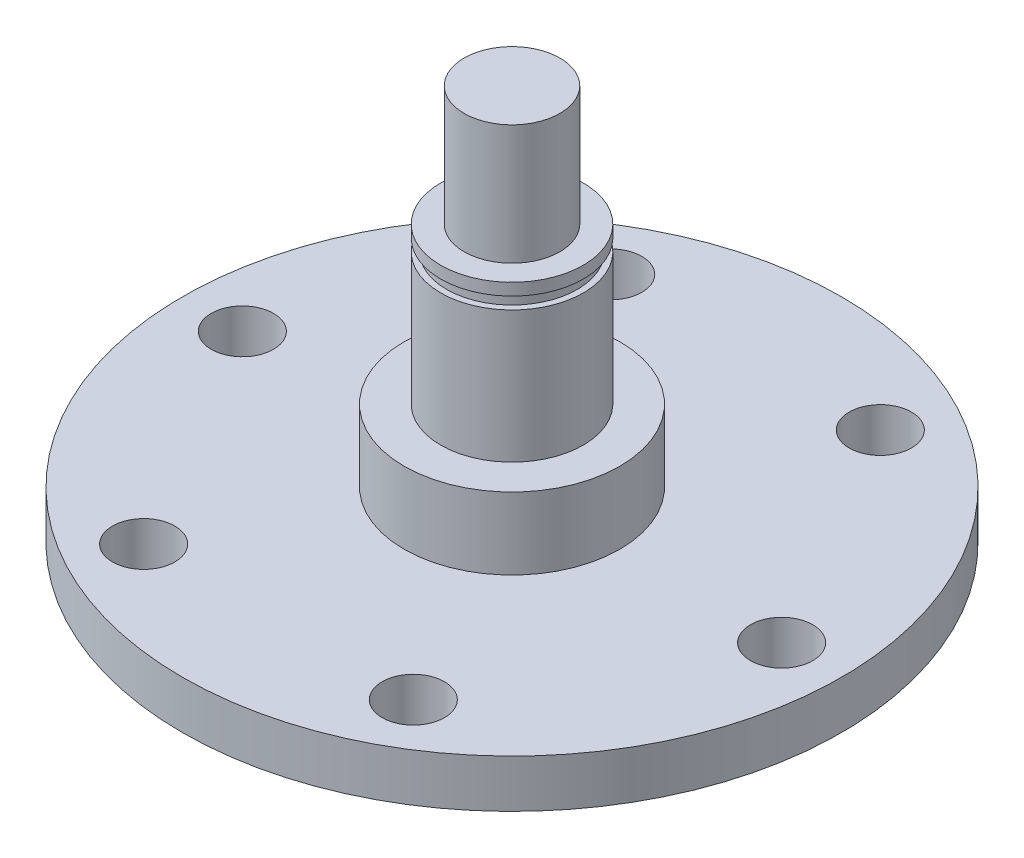
ISO-10303-21;
HEADER;
FILE_DESCRIPTION(('STEP AP214'),'2;1');
FILE_NAME('part.step','',(''),(''),'','','');
FILE_SCHEMA(('AUTOMOTIVE_DESIGN { 1 0 10303 214 1 1 1 1 }'));
ENDSEC;
DATA;
#1=APPLICATION_CONTEXT('core data for automotive mechanical design processes');
#2=APPLICATION_PROTOCOL_DEFINITION('international standard','automotive_design',2000,#1);
#3=PRODUCT_CONTEXT('',#1,'mechanical');
#4=PRODUCT('Part','Part','',(#3));
#5=PRODUCT_RELATED_PRODUCT_CATEGORY('part','',(#4));
#6=PRODUCT_DEFINITION_FORMATION('','',#4);
#7=PRODUCT_DEFINITION_CONTEXT('part definition',#1,'design');
#8=PRODUCT_DEFINITION('design','',#6,#7);
#9=PRODUCT_DEFINITION_SHAPE('','',#8);
#10=(LENGTH_UNIT() NAMED_UNIT(*) SI_UNIT(.MILLI.,.METRE.));
#11=(NAMED_UNIT(*) PLANE_ANGLE_UNIT() SI_UNIT($,.RADIAN.));
#12=(NAMED_UNIT(*) SI_UNIT($,.STERADIAN.) SOLID_ANGLE_UNIT());
#13=UNCERTAINTY_MEASURE_WITH_UNIT(LENGTH_MEASURE(1.E-05),#10,'distance_accuracy_value','');
#14=(GEOMETRIC_REPRESENTATION_CONTEXT(3) GLOBAL_UNCERTAINTY_ASSIGNED_CONTEXT((#13)) GLOBAL_UNIT_ASSIGNED_CONTEXT((#10,
#11,#12)) REPRESENTATION_CONTEXT('',''));
#15=CARTESIAN_POINT('',(0.,0.,0.));
#16=DIRECTION('',(0.,0.,1.));
#17=DIRECTION('',(1.,0.,0.));
#18=AXIS2_PLACEMENT_3D('',#15,#16,#17);
#19=CARTESIAN_POINT('',(0.,0.,0.));
#20=DIRECTION('',(0.,1.,0.));
#21=DIRECTION('',(0.,0.,1.));
#22=AXIS2_PLACEMENT_3D('',#19,#20,#21);
#23=PLANE('',#22);
#24=CARTESIAN_POINT('',(11.2500000000002,0.,-19.4855715851497));
#25=DIRECTION('',(0.,1.,0.));
#26=DIRECTION('',(0.,0.,1.));
#27=AXIS2_PLACEMENT_3D('',#24,#25,#26);
#28=CIRCLE('',#27,2.6);
#29=CARTESIAN_POINT('',(11.2500000000002,0.,-16.8855715851497));
#30=VERTEX_POINT('',#29);
#31=EDGE_CURVE('E103',#30,#30,#28,.T.);
#32=ORIENTED_EDGE('',*,*,#31,.T.);
#33=EDGE_LOOP('',(#32));
#34=FACE_BOUND('',#33,.T.);
#35=CARTESIAN_POINT('',(-11.2499999999998,0.,-19.48557158515));
#36=DIRECTION('',(0.,1.,0.));
#37=DIRECTION('',(0.,0.,1.));
#38=AXIS2_PLACEMENT_3D('',#35,#36,#37);
#39=CIRCLE('',#38,2.6);
#40=CARTESIAN_POINT('',(-11.2499999999998,0.,-16.88557158515));
#41=VERTEX_POINT('',#40);
#42=EDGE_CURVE('E97',#41,#41,#39,.T.);
#43=ORIENTED_EDGE('',*,*,#42,.T.);
#44=EDGE_LOOP('',(#43));
#45=FACE_BOUND('',#44,.T.);
#46=CARTESIAN_POINT('',(-22.5,0.,-1.57116660247941E-13));
#47=DIRECTION('',(0.,1.,0.));
#48=DIRECTION('',(0.,0.,1.));
#49=AXIS2_PLACEMENT_3D('',#46,#47,#48);
#50=CIRCLE('',#49,2.6);
#51=CARTESIAN_POINT('',(-22.5,0.,2.59999999999984));
#52=VERTEX_POINT('',#51);
#53=EDGE_CURVE('E91',#52,#52,#50,.T.);
#54=ORIENTED_EDGE('',*,*,#53,.T.);
#55=EDGE_LOOP('',(#54));
#56=FACE_BOUND('',#55,.T.);
#57=CARTESIAN_POINT('',(-11.2500000000001,0.,19.4855715851498));
#58=DIRECTION('',(0.,1.,0.));
#59=DIRECTION('',(0.,0.,1.));
#60=AXIS2_PLACEMENT_3D('',#57,#58,#59);
#61=CIRCLE('',#60,2.6);
#62=CARTESIAN_POINT('',(-11.2500000000001,0.,22.0855715851498));
#63=VERTEX_POINT('',#62);
#64=EDGE_CURVE('E85',#63,#63,#61,.T.);
#65=ORIENTED_EDGE('',*,*,#64,.T.);
#66=EDGE_LOOP('',(#65));
#67=FACE_BOUND('',#66,.T.);
#68=CARTESIAN_POINT('',(11.25,0.,19.4855715851499));
#69=DIRECTION('',(0.,1.,0.));
#70=DIRECTION('',(0.,0.,1.));
#71=AXIS2_PLACEMENT_3D('',#68,#69,#70);
#72=CIRCLE('',#71,2.6);
#73=CARTESIAN_POINT('',(11.25,0.,22.0855715851499));
#74=VERTEX_POINT('',#73);
#75=EDGE_CURVE('E79',#74,#74,#72,.T.);
#76=ORIENTED_EDGE('',*,*,#75,.T.);
#77=EDGE_LOOP('',(#76));
#78=FACE_BOUND('',#77,.T.);
#79=CARTESIAN_POINT('',(22.5,0.,0.));
#80=DIRECTION('',(0.,1.,0.));
#81=DIRECTION('',(0.,0.,1.));
#82=AXIS2_PLACEMENT_3D('',#79,#80,#81);
#83=CIRCLE('',#82,2.6);
#84=CARTESIAN_POINT('',(22.5,0.,2.6));
#85=VERTEX_POINT('',#84);
#86=EDGE_CURVE('E75',#85,#85,#83,.T.);
#87=ORIENTED_EDGE('',*,*,#86,.T.);
#88=EDGE_LOOP('',(#87));
#89=FACE_BOUND('',#88,.T.);
#90=CARTESIAN_POINT('',(0.,0.,0.));
#91=DIRECTION('',(0.,1.,0.));
#92=DIRECTION('',(0.,0.,1.));
#93=AXIS2_PLACEMENT_3D('',#90,#91,#92);
#94=CIRCLE('',#93,27.5);
#95=CARTESIAN_POINT('',(0.,0.,27.5));
#96=VERTEX_POINT('',#95);
#97=EDGE_CURVE('E10',#96,#96,#94,.T.);
#98=ORIENTED_EDGE('',*,*,#97,.F.);
#99=EDGE_LOOP('',(#98));
#100=FACE_BOUND('',#99,.T.);
#101=ADVANCED_FACE('F32',(#34,#45,#56,#67,#78,#89,#100),#23,.F.);
#102=CARTESIAN_POINT('',(0.,23.5,0.));
#103=DIRECTION('',(0.,1.,0.));
#104=DIRECTION('',(0.,0.,1.));
#105=AXIS2_PLACEMENT_3D('',#102,#103,#104);
#106=CYLINDRICAL_SURFACE('',#105,27.5);
#107=CARTESIAN_POINT('',(0.,4.,0.));
#108=DIRECTION('',(0.,1.,0.));
#109=DIRECTION('',(0.,0.,1.));
#110=AXIS2_PLACEMENT_3D('',#107,#108,#109);
#111=CIRCLE('',#110,27.5);
#112=CARTESIAN_POINT('',(0.,4.,27.5));
#113=VERTEX_POINT('',#112);
#114=EDGE_CURVE('E38',#113,#113,#111,.T.);
#115=ORIENTED_EDGE('',*,*,#114,.F.);
#116=EDGE_LOOP('',(#115));
#117=FACE_BOUND('',#116,.T.);
#118=ORIENTED_EDGE('',*,*,#97,.T.);
#119=EDGE_LOOP('',(#118));
#120=FACE_BOUND('',#119,.T.);
#121=ADVANCED_FACE('F125',(#117,#120),#106,.T.);
#122=CARTESIAN_POINT('',(27.5,4.,0.));
#123=DIRECTION('',(0.,-1.,0.));
#124=DIRECTION('',(0.,0.,-1.));
#125=AXIS2_PLACEMENT_3D('',#122,#123,#124);
#126=PLANE('',#125);
#127=CARTESIAN_POINT('',(11.2500000000002,4.,-19.4855715851497));
#128=DIRECTION('',(0.,1.,0.));
#129=DIRECTION('',(0.,0.,1.));
#130=AXIS2_PLACEMENT_3D('',#127,#128,#129);
#131=CIRCLE('',#130,2.6);
#132=CARTESIAN_POINT('',(11.2500000000002,4.,-16.8855715851497));
#133=VERTEX_POINT('',#132);
#134=EDGE_CURVE('E106',#133,#133,#131,.T.);
#135=ORIENTED_EDGE('',*,*,#134,.F.);
#136=EDGE_LOOP('',(#135));
#137=FACE_BOUND('',#136,.T.);
#138=CARTESIAN_POINT('',(-11.2499999999998,4.,-19.48557158515));
#139=DIRECTION('',(0.,1.,0.));
#140=DIRECTION('',(0.,0.,1.));
#141=AXIS2_PLACEMENT_3D('',#138,#139,#140);
#142=CIRCLE('',#141,2.6);
#143=CARTESIAN_POINT('',(-11.2499999999998,4.,-16.88557158515));
#144=VERTEX_POINT('',#143);
#145=EDGE_CURVE('E100',#144,#144,#142,.T.);
#146=ORIENTED_EDGE('',*,*,#145,.F.);
#147=EDGE_LOOP('',(#146));
#148=FACE_BOUND('',#147,.T.);
#149=CARTESIAN_POINT('',(-22.5,4.,-1.57116660247941E-13));
#150=DIRECTION('',(0.,1.,0.));
#151=DIRECTION('',(0.,0.,1.));
#152=AXIS2_PLACEMENT_3D('',#149,#150,#151);
#153=CIRCLE('',#152,2.6);
#154=CARTESIAN_POINT('',(-22.5,4.,2.59999999999984));
#155=VERTEX_POINT('',#154);
#156=EDGE_CURVE('E94',#155,#155,#153,.T.);
#157=ORIENTED_EDGE('',*,*,#156,.F.);
#158=EDGE_LOOP('',(#157));
#159=FACE_BOUND('',#158,.T.);
#160=CARTESIAN_POINT('',(-11.2500000000001,4.,19.4855715851498));
#161=DIRECTION('',(0.,1.,0.));
#162=DIRECTION('',(0.,0.,1.));
#163=AXIS2_PLACEMENT_3D('',#160,#161,#162);
#164=CIRCLE('',#163,2.6);
#165=CARTESIAN_POINT('',(-11.2500000000001,4.,22.0855715851498));
#166=VERTEX_POINT('',#165);
#167=EDGE_CURVE('E88',#166,#166,#164,.T.);
#168=ORIENTED_EDGE('',*,*,#167,.F.);
#169=EDGE_LOOP('',(#168));
#170=FACE_BOUND('',#169,.T.);
#171=CARTESIAN_POINT('',(11.25,4.,19.4855715851499));
#172=DIRECTION('',(0.,1.,0.));
#173=DIRECTION('',(0.,0.,1.));
#174=AXIS2_PLACEMENT_3D('',#171,#172,#173);
#175=CIRCLE('',#174,2.6);
#176=CARTESIAN_POINT('',(11.25,4.,22.0855715851499));
#177=VERTEX_POINT('',#176);
#178=EDGE_CURVE('E82',#177,#177,#175,.T.);
#179=ORIENTED_EDGE('',*,*,#178,.F.);
#180=EDGE_LOOP('',(#179));
#181=FACE_BOUND('',#180,.T.);
#182=CARTESIAN_POINT('',(22.5,4.,0.));
#183=DIRECTION('',(0.,1.,0.));
#184=DIRECTION('',(0.,0.,1.));
#185=AXIS2_PLACEMENT_3D('',#182,#183,#184);
#186=CIRCLE('',#185,2.6);
#187=CARTESIAN_POINT('',(22.5,4.,2.6));
#188=VERTEX_POINT('',#187);
#189=EDGE_CURVE('E76',#188,#188,#186,.T.);
#190=ORIENTED_EDGE('',*,*,#189,.F.);
#191=EDGE_LOOP('',(#190));
#192=FACE_BOUND('',#191,.T.);
#193=CARTESIAN_POINT('',(0.,4.,0.));
#194=DIRECTION('',(0.,1.,0.));
#195=DIRECTION('',(0.,0.,1.));
#196=AXIS2_PLACEMENT_3D('',#193,#194,#195);
#197=CIRCLE('',#196,9.);
#198=CARTESIAN_POINT('',(0.,4.,9.));
#199=VERTEX_POINT('',#198);
#200=EDGE_CURVE('E42',#199,#199,#197,.T.);
#201=ORIENTED_EDGE('',*,*,#200,.F.);
#202=EDGE_LOOP('',(#201));
#203=FACE_BOUND('',#202,.T.);
#204=ORIENTED_EDGE('',*,*,#114,.T.);
#205=EDGE_LOOP('',(#204));
#206=FACE_BOUND('',#205,.T.);
#207=ADVANCED_FACE('F121',(#137,#148,#159,#170,#181,#192,#203,#206),#126,.F.);
#208=CARTESIAN_POINT('',(0.,23.5,0.));
#209=DIRECTION('',(0.,1.,0.));
#210=DIRECTION('',(0.,0.,1.));
#211=AXIS2_PLACEMENT_3D('',#208,#209,#210);
#212=CYLINDRICAL_SURFACE('',#211,9.);
#213=CARTESIAN_POINT('',(0.,10.,0.));
#214=DIRECTION('',(0.,1.,0.));
#215=DIRECTION('',(0.,0.,1.));
#216=AXIS2_PLACEMENT_3D('',#213,#214,#215);
#217=CIRCLE('',#216,9.);
#218=CARTESIAN_POINT('',(0.,10.,9.));
#219=VERTEX_POINT('',#218);
#220=EDGE_CURVE('E46',#219,#219,#217,.T.);
#221=ORIENTED_EDGE('',*,*,#220,.F.);
#222=EDGE_LOOP('',(#221));
#223=FACE_BOUND('',#222,.T.);
#224=ORIENTED_EDGE('',*,*,#200,.T.);
#225=EDGE_LOOP('',(#224));
#226=FACE_BOUND('',#225,.T.);
#227=ADVANCED_FACE('F124',(#223,#226),#212,.T.);
#228=CARTESIAN_POINT('',(9.,10.,0.));
#229=DIRECTION('',(0.,-1.,0.));
#230=DIRECTION('',(0.,0.,-1.));
#231=AXIS2_PLACEMENT_3D('',#228,#229,#230);
#232=PLANE('',#231);
#233=CARTESIAN_POINT('',(0.,10.,0.));
#234=DIRECTION('',(0.,1.,0.));
#235=DIRECTION('',(0.,0.,1.));
#236=AXIS2_PLACEMENT_3D('',#233,#234,#235);
#237=CIRCLE('',#236,5.95);
#238=CARTESIAN_POINT('',(0.,10.,5.95));
#239=VERTEX_POINT('',#238);
#240=EDGE_CURVE('E51',#239,#239,#237,.T.);
#241=ORIENTED_EDGE('',*,*,#240,.F.);
#242=EDGE_LOOP('',(#241));
#243=FACE_BOUND('',#242,.T.);
#244=ORIENTED_EDGE('',*,*,#220,.T.);
#245=EDGE_LOOP('',(#244));
#246=FACE_BOUND('',#245,.T.);
#247=ADVANCED_FACE('F140',(#243,#246),#232,.F.);
#248=CARTESIAN_POINT('',(0.,23.5,0.));
#249=DIRECTION('',(0.,1.,0.));
#250=DIRECTION('',(0.,0.,1.));
#251=AXIS2_PLACEMENT_3D('',#248,#249,#250);
#252=CYLINDRICAL_SURFACE('',#251,5.95);
#253=CARTESIAN_POINT('',(0.,21.,0.));
#254=DIRECTION('',(0.,1.,0.));
#255=DIRECTION('',(0.,0.,1.));
#256=AXIS2_PLACEMENT_3D('',#253,#254,#255);
#257=CIRCLE('',#256,5.95);
#258=CARTESIAN_POINT('',(0.,21.,5.95));
#259=VERTEX_POINT('',#258);
#260=EDGE_CURVE('E54',#259,#259,#257,.T.);
#261=ORIENTED_EDGE('',*,*,#260,.F.);
#262=EDGE_LOOP('',(#261));
#263=FACE_BOUND('',#262,.T.);
#264=ORIENTED_EDGE('',*,*,#240,.T.);
#265=EDGE_LOOP('',(#264));
#266=FACE_BOUND('',#265,.T.);
#267=ADVANCED_FACE('F146',(#263,#266),#252,.T.);
#268=CARTESIAN_POINT('',(5.95,21.,0.));
#269=DIRECTION('',(0.,-1.,0.));
#270=DIRECTION('',(0.,0.,-1.));
#271=AXIS2_PLACEMENT_3D('',#268,#269,#270);
#272=PLANE('',#271);
#273=CARTESIAN_POINT('',(0.,21.,0.));
#274=DIRECTION('',(0.,1.,0.));
#275=DIRECTION('',(0.,0.,1.));
#276=AXIS2_PLACEMENT_3D('',#273,#274,#275);
#277=CIRCLE('',#276,5.45);
#278=CARTESIAN_POINT('',(0.,21.,5.45));
#279=VERTEX_POINT('',#278);
#280=EDGE_CURVE('E57',#279,#279,#277,.T.);
#281=ORIENTED_EDGE('',*,*,#280,.F.);
#282=EDGE_LOOP('',(#281));
#283=FACE_BOUND('',#282,.T.);
#284=ORIENTED_EDGE('',*,*,#260,.T.);
#285=EDGE_LOOP('',(#284));
#286=FACE_BOUND('',#285,.T.);
#287=ADVANCED_FACE('F251',(#283,#286),#272,.F.);
#288=CARTESIAN_POINT('',(0.,23.5,0.));
#289=DIRECTION('',(0.,1.,0.));
#290=DIRECTION('',(0.,0.,1.));
#291=AXIS2_PLACEMENT_3D('',#288,#289,#290);
#292=CYLINDRICAL_SURFACE('',#291,5.45);
#293=CARTESIAN_POINT('',(0.,22.,0.));
#294=DIRECTION('',(0.,1.,0.));
#295=DIRECTION('',(0.,0.,1.));
#296=AXIS2_PLACEMENT_3D('',#293,#294,#295);
#297=CIRCLE('',#296,5.45);
#298=CARTESIAN_POINT('',(0.,22.,5.45));
#299=VERTEX_POINT('',#298);
#300=EDGE_CURVE('E60',#299,#299,#297,.T.);
#301=ORIENTED_EDGE('',*,*,#300,.F.);
#302=EDGE_LOOP('',(#301));
#303=FACE_BOUND('',#302,.T.);
#304=ORIENTED_EDGE('',*,*,#280,.T.);
#305=EDGE_LOOP('',(#304));
#306=FACE_BOUND('',#305,.T.);
#307=ADVANCED_FACE('F247',(#303,#306),#292,.T.);
#308=CARTESIAN_POINT('',(5.45,22.,0.));
#309=DIRECTION('',(0.,1.,0.));
#310=DIRECTION('',(0.,0.,1.));
#311=AXIS2_PLACEMENT_3D('',#308,#309,#310);
#312=PLANE('',#311);
#313=CARTESIAN_POINT('',(0.,22.,0.));
#314=DIRECTION('',(0.,1.,0.));
#315=DIRECTION('',(0.,0.,1.));
#316=AXIS2_PLACEMENT_3D('',#313,#314,#315);
#317=CIRCLE('',#316,5.95);
#318=CARTESIAN_POINT('',(0.,22.,5.95));
#319=VERTEX_POINT('',#318);
#320=EDGE_CURVE('E63',#319,#319,#317,.T.);
#321=ORIENTED_EDGE('',*,*,#320,.F.);
#322=EDGE_LOOP('',(#321));
#323=FACE_BOUND('',#322,.T.);
#324=ORIENTED_EDGE('',*,*,#300,.T.);
#325=EDGE_LOOP('',(#324));
#326=FACE_BOUND('',#325,.T.);
#327=ADVANCED_FACE('F243',(#323,#326),#312,.F.);
#328=CARTESIAN_POINT('',(0.,23.5,0.));
#329=DIRECTION('',(0.,1.,0.));
#330=DIRECTION('',(0.,0.,1.));
#331=AXIS2_PLACEMENT_3D('',#328,#329,#330);
#332=CYLINDRICAL_SURFACE('',#331,5.95);
#333=CARTESIAN_POINT('',(0.,23.,0.));
#334=DIRECTION('',(0.,1.,0.));
#335=DIRECTION('',(0.,0.,1.));
#336=AXIS2_PLACEMENT_3D('',#333,#334,#335);
#337=CIRCLE('',#336,5.95);
#338=CARTESIAN_POINT('',(0.,23.,5.95));
#339=VERTEX_POINT('',#338);
#340=EDGE_CURVE('E66',#339,#339,#337,.T.);
#341=ORIENTED_EDGE('',*,*,#340,.F.);
#342=EDGE_LOOP('',(#341));
#343=FACE_BOUND('',#342,.T.);
#344=ORIENTED_EDGE('',*,*,#320,.T.);
#345=EDGE_LOOP('',(#344));
#346=FACE_BOUND('',#345,.T.);
#347=ADVANCED_FACE('F239',(#343,#346),#332,.T.);
#348=CARTESIAN_POINT('',(5.95,23.,0.));
#349=DIRECTION('',(0.,-1.,0.));
#350=DIRECTION('',(0.,0.,-1.));
#351=AXIS2_PLACEMENT_3D('',#348,#349,#350);
#352=PLANE('',#351);
#353=CARTESIAN_POINT('',(0.,23.,0.));
#354=DIRECTION('',(0.,1.,0.));
#355=DIRECTION('',(0.,0.,1.));
#356=AXIS2_PLACEMENT_3D('',#353,#354,#355);
#357=CIRCLE('',#356,4.);
#358=CARTESIAN_POINT('',(0.,23.,4.));
#359=VERTEX_POINT('',#358);
#360=EDGE_CURVE('E69',#359,#359,#357,.T.);
#361=ORIENTED_EDGE('',*,*,#360,.F.);
#362=EDGE_LOOP('',(#361));
#363=FACE_BOUND('',#362,.T.);
#364=ORIENTED_EDGE('',*,*,#340,.T.);
#365=EDGE_LOOP('',(#364));
#366=FACE_BOUND('',#365,.T.);
#367=ADVANCED_FACE('F235',(#363,#366),#352,.F.);
#368=CARTESIAN_POINT('',(0.,23.5,0.));
#369=DIRECTION('',(0.,1.,0.));
#370=DIRECTION('',(0.,0.,1.));
#371=AXIS2_PLACEMENT_3D('',#368,#369,#370);
#372=CYLINDRICAL_SURFACE('',#371,4.);
#373=CARTESIAN_POINT('',(0.,33.,0.));
#374=DIRECTION('',(0.,1.,0.));
#375=DIRECTION('',(0.,0.,1.));
#376=AXIS2_PLACEMENT_3D('',#373,#374,#375);
#377=CIRCLE('',#376,4.);
#378=CARTESIAN_POINT('',(0.,33.,4.));
#379=VERTEX_POINT('',#378);
#380=EDGE_CURVE('E72',#379,#379,#377,.T.);
#381=ORIENTED_EDGE('',*,*,#380,.F.);
#382=EDGE_LOOP('',(#381));
#383=FACE_BOUND('',#382,.T.);
#384=ORIENTED_EDGE('',*,*,#360,.T.);
#385=EDGE_LOOP('',(#384));
#386=FACE_BOUND('',#385,.T.);
#387=ADVANCED_FACE('F231',(#383,#386),#372,.T.);
#388=CARTESIAN_POINT('',(4.,33.,0.));
#389=DIRECTION('',(0.,-1.,0.));
#390=DIRECTION('',(0.,0.,-1.));
#391=AXIS2_PLACEMENT_3D('',#388,#389,#390);
#392=PLANE('',#391);
#393=ORIENTED_EDGE('',*,*,#380,.T.);
#394=EDGE_LOOP('',(#393));
#395=FACE_BOUND('',#394,.T.);
#396=ADVANCED_FACE('F176',(#395),#392,.F.);
#397=CARTESIAN_POINT('',(22.5,0.,0.));
#398=DIRECTION('',(0.,1.,0.));
#399=DIRECTION('',(0.,0.,1.));
#400=AXIS2_PLACEMENT_3D('',#397,#398,#399);
#401=CYLINDRICAL_SURFACE('',#400,2.6);
#402=ORIENTED_EDGE('',*,*,#86,.F.);
#403=EDGE_LOOP('',(#402));
#404=FACE_BOUND('',#403,.T.);
#405=ORIENTED_EDGE('',*,*,#189,.T.);
#406=EDGE_LOOP('',(#405));
#407=FACE_BOUND('',#406,.T.);
#408=ADVANCED_FACE('F170',(#404,#407),#401,.F.);
#409=CARTESIAN_POINT('',(11.25,0.,19.4855715851499));
#410=DIRECTION('',(0.,1.,0.));
#411=DIRECTION('',(0.,0.,1.));
#412=AXIS2_PLACEMENT_3D('',#409,#410,#411);
#413=CYLINDRICAL_SURFACE('',#412,2.6);
#414=ORIENTED_EDGE('',*,*,#75,.F.);
#415=EDGE_LOOP('',(#414));
#416=FACE_BOUND('',#415,.T.);
#417=ORIENTED_EDGE('',*,*,#178,.T.);
#418=EDGE_LOOP('',(#417));
#419=FACE_BOUND('',#418,.T.);
#420=ADVANCED_FACE('F175',(#416,#419),#413,.F.);
#421=CARTESIAN_POINT('',(-11.2500000000001,0.,19.4855715851498));
#422=DIRECTION('',(0.,1.,0.));
#423=DIRECTION('',(0.,0.,1.));
#424=AXIS2_PLACEMENT_3D('',#421,#422,#423);
#425=CYLINDRICAL_SURFACE('',#424,2.6);
#426=ORIENTED_EDGE('',*,*,#64,.F.);
#427=EDGE_LOOP('',(#426));
#428=FACE_BOUND('',#427,.T.);
#429=ORIENTED_EDGE('',*,*,#167,.T.);
#430=EDGE_LOOP('',(#429));
#431=FACE_BOUND('',#430,.T.);
#432=ADVANCED_FACE('F188',(#428,#431),#425,.F.);
#433=CARTESIAN_POINT('',(-22.5,0.,-1.57116660247941E-13));
#434=DIRECTION('',(0.,1.,0.));
#435=DIRECTION('',(0.,0.,1.));
#436=AXIS2_PLACEMENT_3D('',#433,#434,#435);
#437=CYLINDRICAL_SURFACE('',#436,2.6);
#438=ORIENTED_EDGE('',*,*,#53,.F.);
#439=EDGE_LOOP('',(#438));
#440=FACE_BOUND('',#439,.T.);
#441=ORIENTED_EDGE('',*,*,#156,.T.);
#442=EDGE_LOOP('',(#441));
#443=FACE_BOUND('',#442,.T.);
#444=ADVANCED_FACE('F198',(#440,#443),#437,.F.);
#445=CARTESIAN_POINT('',(-11.2499999999998,0.,-19.48557158515));
#446=DIRECTION('',(0.,1.,0.));
#447=DIRECTION('',(0.,0.,1.));
#448=AXIS2_PLACEMENT_3D('',#445,#446,#447);
#449=CYLINDRICAL_SURFACE('',#448,2.6);
#450=ORIENTED_EDGE('',*,*,#42,.F.);
#451=EDGE_LOOP('',(#450));
#452=FACE_BOUND('',#451,.T.);
#453=ORIENTED_EDGE('',*,*,#145,.T.);
#454=EDGE_LOOP('',(#453));
#455=FACE_BOUND('',#454,.T.);
#456=ADVANCED_FACE('F117',(#452,#455),#449,.F.);
#457=CARTESIAN_POINT('',(11.2500000000002,0.,-19.4855715851497));
#458=DIRECTION('',(0.,1.,0.));
#459=DIRECTION('',(0.,0.,1.));
#460=AXIS2_PLACEMENT_3D('',#457,#458,#459);
#461=CYLINDRICAL_SURFACE('',#460,2.6);
#462=ORIENTED_EDGE('',*,*,#31,.F.);
#463=EDGE_LOOP('',(#462));
#464=FACE_BOUND('',#463,.T.);
#465=ORIENTED_EDGE('',*,*,#134,.T.);
#466=EDGE_LOOP('',(#465));
#467=FACE_BOUND('',#466,.T.);
#468=ADVANCED_FACE('F114',(#464,#467),#461,.F.);
#469=CLOSED_SHELL('',(#101,#121,#207,#227,#247,#267,#287,#307,#327,#347,#367,#387,#396,#408,
#420,#432,#444,#456,#468));
#470=MANIFOLD_SOLID_BREP('B2',#469);
#471=ADVANCED_BREP_SHAPE_REPRESENTATION('',(#18,#470),#14);
#472=SHAPE_DEFINITION_REPRESENTATION(#9,#471);
ENDSEC;
END-ISO-10303-21;
